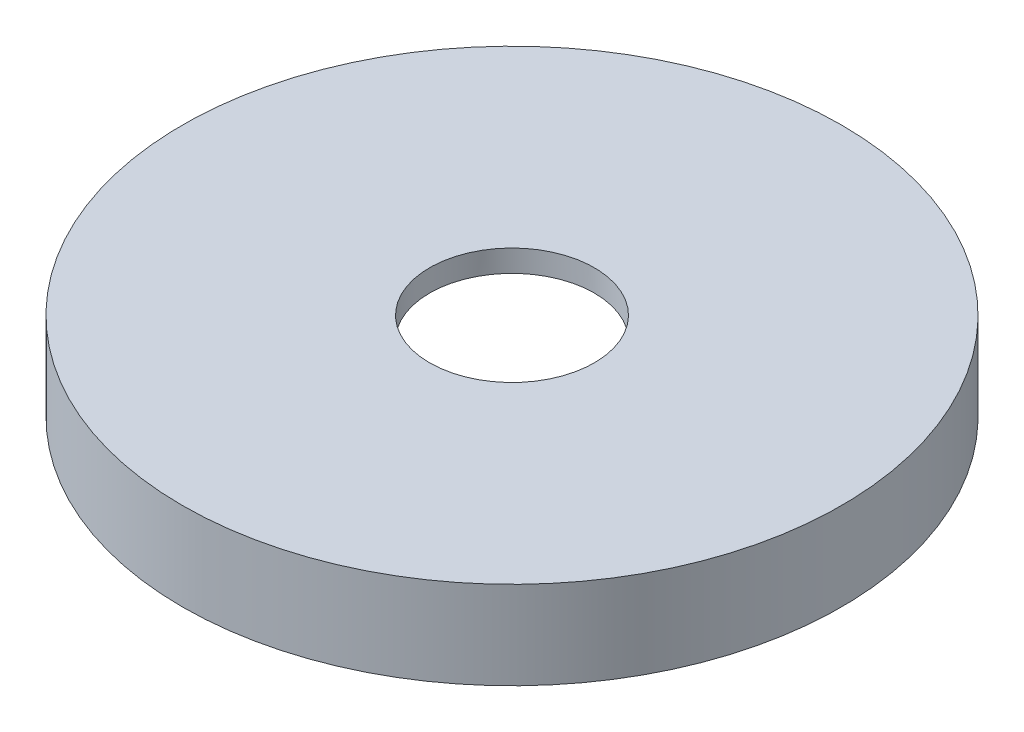
ISO-10303-21;
HEADER;
FILE_DESCRIPTION(('STEP AP214'),'2;1');
FILE_NAME('part.step','',(''),(''),'','','');
FILE_SCHEMA(('AUTOMOTIVE_DESIGN { 1 0 10303 214 1 1 1 1 }'));
ENDSEC;
DATA;
#1=APPLICATION_CONTEXT('core data for automotive mechanical design processes');
#2=APPLICATION_PROTOCOL_DEFINITION('international standard','automotive_design',2000,#1);
#3=PRODUCT_CONTEXT('',#1,'mechanical');
#4=PRODUCT('Part','Part','',(#3));
#5=PRODUCT_RELATED_PRODUCT_CATEGORY('part','',(#4));
#6=PRODUCT_DEFINITION_FORMATION('','',#4);
#7=PRODUCT_DEFINITION_CONTEXT('part definition',#1,'design');
#8=PRODUCT_DEFINITION('design','',#6,#7);
#9=PRODUCT_DEFINITION_SHAPE('','',#8);
#10=(LENGTH_UNIT() NAMED_UNIT(*) SI_UNIT(.MILLI.,.METRE.));
#11=(NAMED_UNIT(*) PLANE_ANGLE_UNIT() SI_UNIT($,.RADIAN.));
#12=(NAMED_UNIT(*) SI_UNIT($,.STERADIAN.) SOLID_ANGLE_UNIT());
#13=UNCERTAINTY_MEASURE_WITH_UNIT(LENGTH_MEASURE(1.E-05),#10,'distance_accuracy_value','');
#14=(GEOMETRIC_REPRESENTATION_CONTEXT(3) GLOBAL_UNCERTAINTY_ASSIGNED_CONTEXT((#13)) GLOBAL_UNIT_ASSIGNED_CONTEXT((#10,
#11,#12)) REPRESENTATION_CONTEXT('',''));
#15=CARTESIAN_POINT('',(0.,0.,0.));
#16=DIRECTION('',(0.,0.,1.));
#17=DIRECTION('',(1.,0.,0.));
#18=AXIS2_PLACEMENT_3D('',#15,#16,#17);
#19=CARTESIAN_POINT('',(0.,8.,0.));
#20=DIRECTION('',(0.,-1.,0.));
#21=DIRECTION('',(0.,0.,-1.));
#22=AXIS2_PLACEMENT_3D('',#19,#20,#21);
#23=CYLINDRICAL_SURFACE('',#22,30.);
#24=CARTESIAN_POINT('',(0.,8.,0.));
#25=DIRECTION('',(0.,1.,0.));
#26=DIRECTION('',(0.,0.,1.));
#27=AXIS2_PLACEMENT_3D('',#24,#25,#26);
#28=CIRCLE('',#27,30.);
#29=CARTESIAN_POINT('',(0.,8.,30.));
#30=VERTEX_POINT('',#29);
#31=EDGE_CURVE('E10',#30,#30,#28,.T.);
#32=ORIENTED_EDGE('',*,*,#31,.F.);
#33=EDGE_LOOP('',(#32));
#34=FACE_BOUND('',#33,.T.);
#35=CARTESIAN_POINT('',(0.,0.,0.));
#36=DIRECTION('',(0.,1.,0.));
#37=DIRECTION('',(0.,0.,1.));
#38=AXIS2_PLACEMENT_3D('',#35,#36,#37);
#39=CIRCLE('',#38,30.);
#40=CARTESIAN_POINT('',(0.,0.,30.));
#41=VERTEX_POINT('',#40);
#42=EDGE_CURVE('E38',#41,#41,#39,.T.);
#43=ORIENTED_EDGE('',*,*,#42,.T.);
#44=EDGE_LOOP('',(#43));
#45=FACE_BOUND('',#44,.T.);
#46=ADVANCED_FACE('F31',(#34,#45),#23,.T.);
#47=CARTESIAN_POINT('',(0.,8.,0.));
#48=DIRECTION('',(0.,1.,0.));
#49=DIRECTION('',(0.,0.,1.));
#50=AXIS2_PLACEMENT_3D('',#47,#48,#49);
#51=PLANE('',#50);
#52=CARTESIAN_POINT('',(0.,8.,0.));
#53=DIRECTION('',(0.,1.,0.));
#54=DIRECTION('',(0.,0.,1.));
#55=AXIS2_PLACEMENT_3D('',#52,#53,#54);
#56=CIRCLE('',#55,7.5);
#57=CARTESIAN_POINT('',(0.,8.,7.5));
#58=VERTEX_POINT('',#57);
#59=EDGE_CURVE('E50',#58,#58,#56,.T.);
#60=ORIENTED_EDGE('',*,*,#59,.F.);
#61=EDGE_LOOP('',(#60));
#62=FACE_BOUND('',#61,.T.);
#63=ORIENTED_EDGE('',*,*,#31,.T.);
#64=EDGE_LOOP('',(#63));
#65=FACE_BOUND('',#64,.T.);
#66=ADVANCED_FACE('F74',(#62,#65),#51,.T.);
#67=CARTESIAN_POINT('',(0.,0.,0.));
#68=DIRECTION('',(0.,1.,0.));
#69=DIRECTION('',(0.,0.,1.));
#70=AXIS2_PLACEMENT_3D('',#67,#68,#69);
#71=PLANE('',#70);
#72=CARTESIAN_POINT('',(0.,0.,0.));
#73=DIRECTION('',(0.,-1.,0.));
#74=DIRECTION('',(0.,0.,-1.));
#75=AXIS2_PLACEMENT_3D('',#72,#73,#74);
#76=CIRCLE('',#75,17.5);
#77=CARTESIAN_POINT('',(0.,0.,-17.5));
#78=VERTEX_POINT('',#77);
#79=EDGE_CURVE('E45',#78,#78,#76,.T.);
#80=ORIENTED_EDGE('',*,*,#79,.F.);
#81=EDGE_LOOP('',(#80));
#82=FACE_BOUND('',#81,.T.);
#83=ORIENTED_EDGE('',*,*,#42,.F.);
#84=EDGE_LOOP('',(#83));
#85=FACE_BOUND('',#84,.T.);
#86=ADVANCED_FACE('F68',(#82,#85),#71,.F.);
#87=CARTESIAN_POINT('',(0.,6.,0.));
#88=DIRECTION('',(0.,-1.,0.));
#89=DIRECTION('',(0.,0.,-1.));
#90=AXIS2_PLACEMENT_3D('',#87,#88,#89);
#91=CYLINDRICAL_SURFACE('',#90,17.5);
#92=CARTESIAN_POINT('',(0.,6.,0.));
#93=DIRECTION('',(0.,-1.,0.));
#94=DIRECTION('',(0.,0.,-1.));
#95=AXIS2_PLACEMENT_3D('',#92,#93,#94);
#96=CIRCLE('',#95,17.5);
#97=CARTESIAN_POINT('',(0.,6.,-17.5));
#98=VERTEX_POINT('',#97);
#99=EDGE_CURVE('E43',#98,#98,#96,.T.);
#100=ORIENTED_EDGE('',*,*,#99,.F.);
#101=EDGE_LOOP('',(#100));
#102=FACE_BOUND('',#101,.T.);
#103=ORIENTED_EDGE('',*,*,#79,.T.);
#104=EDGE_LOOP('',(#103));
#105=FACE_BOUND('',#104,.T.);
#106=ADVANCED_FACE('F62',(#102,#105),#91,.F.);
#107=CARTESIAN_POINT('',(0.,6.,0.));
#108=DIRECTION('',(0.,-1.,0.));
#109=DIRECTION('',(0.,0.,-1.));
#110=AXIS2_PLACEMENT_3D('',#107,#108,#109);
#111=PLANE('',#110);
#112=CARTESIAN_POINT('',(0.,6.,0.));
#113=DIRECTION('',(0.,-1.,0.));
#114=DIRECTION('',(0.,0.,-1.));
#115=AXIS2_PLACEMENT_3D('',#112,#113,#114);
#116=CIRCLE('',#115,7.5);
#117=CARTESIAN_POINT('',(0.,6.,-7.5));
#118=VERTEX_POINT('',#117);
#119=EDGE_CURVE('E34',#118,#118,#116,.T.);
#120=ORIENTED_EDGE('',*,*,#119,.F.);
#121=EDGE_LOOP('',(#120));
#122=FACE_BOUND('',#121,.T.);
#123=ORIENTED_EDGE('',*,*,#99,.T.);
#124=EDGE_LOOP('',(#123));
#125=FACE_BOUND('',#124,.T.);
#126=ADVANCED_FACE('F59',(#122,#125),#111,.T.);
#127=CARTESIAN_POINT('',(0.,0.,0.));
#128=DIRECTION('',(0.,1.,0.));
#129=DIRECTION('',(0.,0.,1.));
#130=AXIS2_PLACEMENT_3D('',#127,#128,#129);
#131=CYLINDRICAL_SURFACE('',#130,7.5);
#132=ORIENTED_EDGE('',*,*,#119,.T.);
#133=EDGE_LOOP('',(#132));
#134=FACE_BOUND('',#133,.T.);
#135=ORIENTED_EDGE('',*,*,#59,.T.);
#136=EDGE_LOOP('',(#135));
#137=FACE_BOUND('',#136,.T.);
#138=ADVANCED_FACE('F57',(#134,#137),#131,.F.);
#139=CLOSED_SHELL('',(#46,#66,#86,#106,#126,#138));
#140=MANIFOLD_SOLID_BREP('B2',#139);
#141=ADVANCED_BREP_SHAPE_REPRESENTATION('',(#18,#140),#14);
#142=SHAPE_DEFINITION_REPRESENTATION(#9,#141);
ENDSEC;
END-ISO-10303-21;
